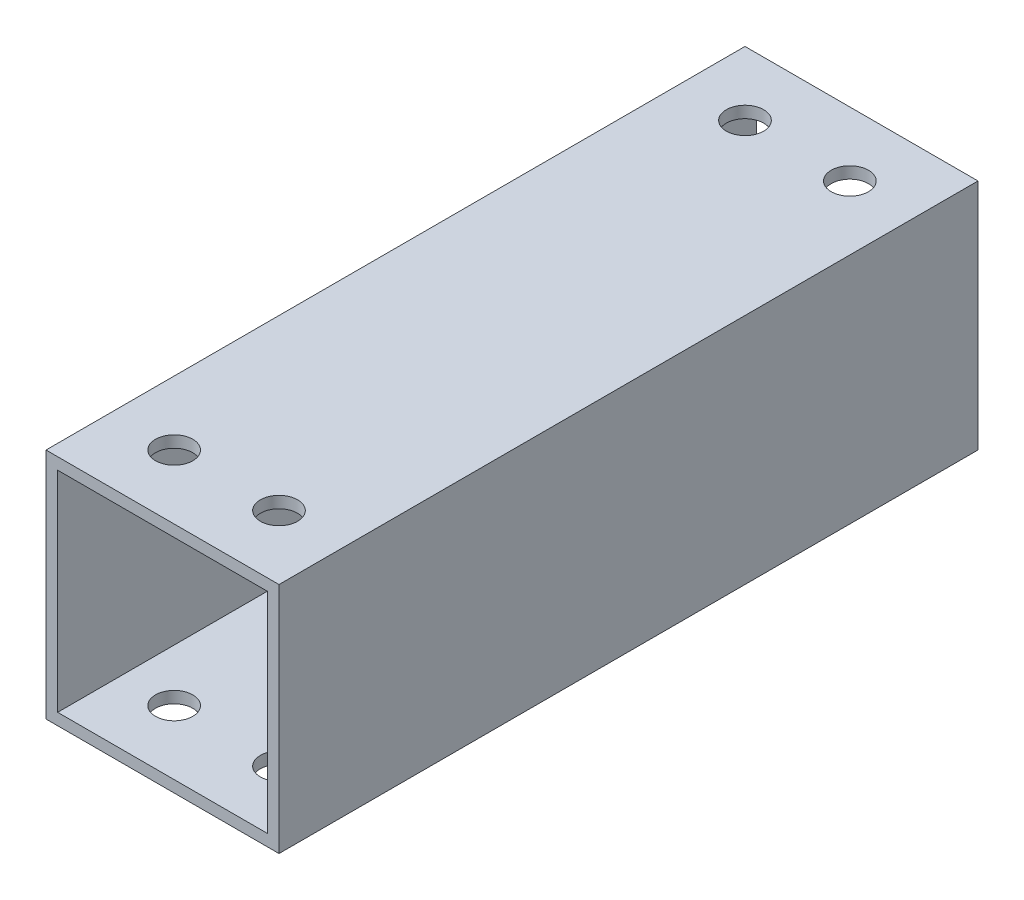
ISO-10303-21;
HEADER;
FILE_DESCRIPTION(('STEP AP214'),'2;1');
FILE_NAME('part.step','',(''),(''),'','','');
FILE_SCHEMA(('AUTOMOTIVE_DESIGN { 1 0 10303 214 1 1 1 1 }'));
ENDSEC;
DATA;
#1=APPLICATION_CONTEXT('core data for automotive mechanical design processes');
#2=APPLICATION_PROTOCOL_DEFINITION('international standard','automotive_design',2000,#1);
#3=PRODUCT_CONTEXT('',#1,'mechanical');
#4=PRODUCT('Part','Part','',(#3));
#5=PRODUCT_RELATED_PRODUCT_CATEGORY('part','',(#4));
#6=PRODUCT_DEFINITION_FORMATION('','',#4);
#7=PRODUCT_DEFINITION_CONTEXT('part definition',#1,'design');
#8=PRODUCT_DEFINITION('design','',#6,#7);
#9=PRODUCT_DEFINITION_SHAPE('','',#8);
#10=(LENGTH_UNIT() NAMED_UNIT(*) SI_UNIT(.MILLI.,.METRE.));
#11=(NAMED_UNIT(*) PLANE_ANGLE_UNIT() SI_UNIT($,.RADIAN.));
#12=(NAMED_UNIT(*) SI_UNIT($,.STERADIAN.) SOLID_ANGLE_UNIT());
#13=UNCERTAINTY_MEASURE_WITH_UNIT(LENGTH_MEASURE(1.E-05),#10,'distance_accuracy_value','');
#14=(GEOMETRIC_REPRESENTATION_CONTEXT(3) GLOBAL_UNCERTAINTY_ASSIGNED_CONTEXT((#13)) GLOBAL_UNIT_ASSIGNED_CONTEXT((#10,
#11,#12)) REPRESENTATION_CONTEXT('',''));
#15=CARTESIAN_POINT('',(0.,0.,0.));
#16=DIRECTION('',(0.,0.,1.));
#17=DIRECTION('',(1.,0.,0.));
#18=AXIS2_PLACEMENT_3D('',#15,#16,#17);
#19=CARTESIAN_POINT('',(0.,0.,60.));
#20=DIRECTION('',(0.,0.,1.));
#21=DIRECTION('',(1.,0.,0.));
#22=AXIS2_PLACEMENT_3D('',#19,#20,#21);
#23=PLANE('',#22);
#24=DIRECTION('',(0.,1.,0.));
#25=VECTOR('',#24,1.);
#26=CARTESIAN_POINT('',(10.,10.,60.));
#27=LINE('',#26,#25);
#28=CARTESIAN_POINT('',(10.,-10.,60.));
#29=VERTEX_POINT('',#28);
#30=CARTESIAN_POINT('',(10.,10.,60.));
#31=VERTEX_POINT('',#30);
#32=EDGE_CURVE('E143',#29,#31,#27,.T.);
#33=ORIENTED_EDGE('',*,*,#32,.T.);
#34=DIRECTION('',(-1.,0.,0.));
#35=VECTOR('',#34,1.);
#36=CARTESIAN_POINT('',(-10.,10.,60.));
#37=LINE('',#36,#35);
#38=CARTESIAN_POINT('',(-10.,10.,60.));
#39=VERTEX_POINT('',#38);
#40=EDGE_CURVE('E146',#31,#39,#37,.T.);
#41=ORIENTED_EDGE('',*,*,#40,.T.);
#42=DIRECTION('',(0.,-1.,0.));
#43=VECTOR('',#42,1.);
#44=CARTESIAN_POINT('',(-10.,10.,60.));
#45=LINE('',#44,#43);
#46=CARTESIAN_POINT('',(-10.,-10.,60.));
#47=VERTEX_POINT('',#46);
#48=EDGE_CURVE('E149',#39,#47,#45,.T.);
#49=ORIENTED_EDGE('',*,*,#48,.T.);
#50=DIRECTION('',(1.,0.,0.));
#51=VECTOR('',#50,1.);
#52=CARTESIAN_POINT('',(-10.,-10.,60.));
#53=LINE('',#52,#51);
#54=EDGE_CURVE('E151',#47,#29,#53,.T.);
#55=ORIENTED_EDGE('',*,*,#54,.T.);
#56=EDGE_LOOP('',(#33,#41,#49,#55));
#57=FACE_BOUND('',#56,.T.);
#58=DIRECTION('',(-1.,0.,0.));
#59=VECTOR('',#58,1.);
#60=CARTESIAN_POINT('',(-9.,9.,60.));
#61=LINE('',#60,#59);
#62=CARTESIAN_POINT('',(9.,9.,60.));
#63=VERTEX_POINT('',#62);
#64=CARTESIAN_POINT('',(-9.,9.,60.));
#65=VERTEX_POINT('',#64);
#66=EDGE_CURVE('E113',#63,#65,#61,.T.);
#67=ORIENTED_EDGE('',*,*,#66,.F.);
#68=DIRECTION('',(0.,1.,0.));
#69=VECTOR('',#68,1.);
#70=CARTESIAN_POINT('',(9.,9.,60.));
#71=LINE('',#70,#69);
#72=CARTESIAN_POINT('',(9.00000000000001,-9.,60.));
#73=VERTEX_POINT('',#72);
#74=EDGE_CURVE('E105',#73,#63,#71,.T.);
#75=ORIENTED_EDGE('',*,*,#74,.F.);
#76=DIRECTION('',(1.,0.,0.));
#77=VECTOR('',#76,1.);
#78=CARTESIAN_POINT('',(-8.99999999999999,-9.,60.));
#79=LINE('',#78,#77);
#80=CARTESIAN_POINT('',(-8.99999999999999,-9.,60.));
#81=VERTEX_POINT('',#80);
#82=EDGE_CURVE('E127',#81,#73,#79,.T.);
#83=ORIENTED_EDGE('',*,*,#82,.F.);
#84=DIRECTION('',(0.,-1.,0.));
#85=VECTOR('',#84,1.);
#86=CARTESIAN_POINT('',(-9.,9.,60.));
#87=LINE('',#86,#85);
#88=EDGE_CURVE('E125',#65,#81,#87,.T.);
#89=ORIENTED_EDGE('',*,*,#88,.F.);
#90=EDGE_LOOP('',(#67,#75,#83,#89));
#91=FACE_BOUND('',#90,.T.);
#92=ADVANCED_FACE('F38',(#57,#91),#23,.T.);
#93=CARTESIAN_POINT('',(0.,0.,0.));
#94=DIRECTION('',(0.,0.,1.));
#95=DIRECTION('',(1.,0.,0.));
#96=AXIS2_PLACEMENT_3D('',#93,#94,#95);
#97=PLANE('',#96);
#98=DIRECTION('',(0.,1.,0.));
#99=VECTOR('',#98,1.);
#100=CARTESIAN_POINT('',(10.,10.,0.));
#101=LINE('',#100,#99);
#102=CARTESIAN_POINT('',(10.,-10.,0.));
#103=VERTEX_POINT('',#102);
#104=CARTESIAN_POINT('',(10.,10.,0.));
#105=VERTEX_POINT('',#104);
#106=EDGE_CURVE('E121',#103,#105,#101,.T.);
#107=ORIENTED_EDGE('',*,*,#106,.F.);
#108=DIRECTION('',(1.,0.,0.));
#109=VECTOR('',#108,1.);
#110=CARTESIAN_POINT('',(-10.,-10.,0.));
#111=LINE('',#110,#109);
#112=CARTESIAN_POINT('',(-10.,-10.,0.));
#113=VERTEX_POINT('',#112);
#114=EDGE_CURVE('E147',#113,#103,#111,.T.);
#115=ORIENTED_EDGE('',*,*,#114,.F.);
#116=DIRECTION('',(0.,-1.,0.));
#117=VECTOR('',#116,1.);
#118=CARTESIAN_POINT('',(-10.,10.,0.));
#119=LINE('',#118,#117);
#120=CARTESIAN_POINT('',(-10.,10.,0.));
#121=VERTEX_POINT('',#120);
#122=EDGE_CURVE('E158',#121,#113,#119,.T.);
#123=ORIENTED_EDGE('',*,*,#122,.F.);
#124=DIRECTION('',(-1.,0.,0.));
#125=VECTOR('',#124,1.);
#126=CARTESIAN_POINT('',(-10.,10.,0.));
#127=LINE('',#126,#125);
#128=EDGE_CURVE('E156',#105,#121,#127,.T.);
#129=ORIENTED_EDGE('',*,*,#128,.F.);
#130=EDGE_LOOP('',(#107,#115,#123,#129));
#131=FACE_BOUND('',#130,.T.);
#132=DIRECTION('',(0.,1.,0.));
#133=VECTOR('',#132,1.);
#134=CARTESIAN_POINT('',(9.,9.,0.));
#135=LINE('',#134,#133);
#136=CARTESIAN_POINT('',(9.00000000000001,-9.,0.));
#137=VERTEX_POINT('',#136);
#138=CARTESIAN_POINT('',(9.,9.,0.));
#139=VERTEX_POINT('',#138);
#140=EDGE_CURVE('E63',#137,#139,#135,.T.);
#141=ORIENTED_EDGE('',*,*,#140,.T.);
#142=DIRECTION('',(-1.,0.,0.));
#143=VECTOR('',#142,1.);
#144=CARTESIAN_POINT('',(-9.,9.,0.));
#145=LINE('',#144,#143);
#146=CARTESIAN_POINT('',(-9.,9.,0.));
#147=VERTEX_POINT('',#146);
#148=EDGE_CURVE('E120',#139,#147,#145,.T.);
#149=ORIENTED_EDGE('',*,*,#148,.T.);
#150=DIRECTION('',(0.,-1.,0.));
#151=VECTOR('',#150,1.);
#152=CARTESIAN_POINT('',(-9.,9.,0.));
#153=LINE('',#152,#151);
#154=CARTESIAN_POINT('',(-8.99999999999999,-9.,0.));
#155=VERTEX_POINT('',#154);
#156=EDGE_CURVE('E135',#147,#155,#153,.T.);
#157=ORIENTED_EDGE('',*,*,#156,.T.);
#158=DIRECTION('',(1.,0.,0.));
#159=VECTOR('',#158,1.);
#160=CARTESIAN_POINT('',(-8.99999999999999,-9.,0.));
#161=LINE('',#160,#159);
#162=EDGE_CURVE('E114',#155,#137,#161,.T.);
#163=ORIENTED_EDGE('',*,*,#162,.T.);
#164=EDGE_LOOP('',(#141,#149,#157,#163));
#165=FACE_BOUND('',#164,.T.);
#166=ADVANCED_FACE('F210',(#131,#165),#97,.F.);
#167=CARTESIAN_POINT('',(10.,10.,60.));
#168=DIRECTION('',(-1.,0.,0.));
#169=DIRECTION('',(0.,-1.,0.));
#170=AXIS2_PLACEMENT_3D('',#167,#168,#169);
#171=PLANE('',#170);
#172=ORIENTED_EDGE('',*,*,#106,.T.);
#173=DIRECTION('',(0.,0.,-1.));
#174=VECTOR('',#173,1.);
#175=CARTESIAN_POINT('',(10.,10.,60.));
#176=LINE('',#175,#174);
#177=EDGE_CURVE('E11',#31,#105,#176,.T.);
#178=ORIENTED_EDGE('',*,*,#177,.F.);
#179=ORIENTED_EDGE('',*,*,#32,.F.);
#180=DIRECTION('',(0.,0.,-1.));
#181=VECTOR('',#180,1.);
#182=CARTESIAN_POINT('',(10.,-10.,60.));
#183=LINE('',#182,#181);
#184=EDGE_CURVE('E153',#29,#103,#183,.T.);
#185=ORIENTED_EDGE('',*,*,#184,.T.);
#186=EDGE_LOOP('',(#172,#178,#179,#185));
#187=FACE_BOUND('',#186,.T.);
#188=ADVANCED_FACE('F40',(#187),#171,.F.);
#189=CARTESIAN_POINT('',(-10.,10.,60.));
#190=DIRECTION('',(0.,-1.,0.));
#191=DIRECTION('',(0.,0.,-1.));
#192=AXIS2_PLACEMENT_3D('',#189,#190,#191);
#193=PLANE('',#192);
#194=CARTESIAN_POINT('',(-4.5,10.,54.5));
#195=DIRECTION('',(0.,1.,0.));
#196=DIRECTION('',(0.,0.,-1.));
#197=AXIS2_PLACEMENT_3D('',#194,#195,#196);
#198=CIRCLE('',#197,1.6);
#199=CARTESIAN_POINT('',(-4.5,10.,52.9));
#200=VERTEX_POINT('',#199);
#201=EDGE_CURVE('E246',#200,#200,#198,.T.);
#202=ORIENTED_EDGE('',*,*,#201,.F.);
#203=EDGE_LOOP('',(#202));
#204=FACE_BOUND('',#203,.T.);
#205=CARTESIAN_POINT('',(4.5,10.,54.5));
#206=DIRECTION('',(0.,1.,0.));
#207=DIRECTION('',(0.,0.,1.));
#208=AXIS2_PLACEMENT_3D('',#205,#206,#207);
#209=CIRCLE('',#208,1.6);
#210=CARTESIAN_POINT('',(4.5,10.,56.1));
#211=VERTEX_POINT('',#210);
#212=EDGE_CURVE('E250',#211,#211,#209,.T.);
#213=ORIENTED_EDGE('',*,*,#212,.F.);
#214=EDGE_LOOP('',(#213));
#215=FACE_BOUND('',#214,.T.);
#216=CARTESIAN_POINT('',(4.49999999999999,10.,5.49999999999999));
#217=DIRECTION('',(0.,1.,0.));
#218=DIRECTION('',(0.,0.,-1.));
#219=AXIS2_PLACEMENT_3D('',#216,#217,#218);
#220=CIRCLE('',#219,1.6);
#221=CARTESIAN_POINT('',(4.49999999999999,10.,3.9));
#222=VERTEX_POINT('',#221);
#223=EDGE_CURVE('E254',#222,#222,#220,.T.);
#224=ORIENTED_EDGE('',*,*,#223,.F.);
#225=EDGE_LOOP('',(#224));
#226=FACE_BOUND('',#225,.T.);
#227=CARTESIAN_POINT('',(-4.49999999999999,10.,5.49999999999999));
#228=DIRECTION('',(0.,1.,0.));
#229=DIRECTION('',(0.,0.,1.));
#230=AXIS2_PLACEMENT_3D('',#227,#228,#229);
#231=CIRCLE('',#230,1.6);
#232=CARTESIAN_POINT('',(-4.49999999999999,10.,7.09999999999999));
#233=VERTEX_POINT('',#232);
#234=EDGE_CURVE('E258',#233,#233,#231,.T.);
#235=ORIENTED_EDGE('',*,*,#234,.F.);
#236=EDGE_LOOP('',(#235));
#237=FACE_BOUND('',#236,.T.);
#238=ORIENTED_EDGE('',*,*,#128,.T.);
#239=DIRECTION('',(0.,0.,-1.));
#240=VECTOR('',#239,1.);
#241=CARTESIAN_POINT('',(-10.,10.,60.));
#242=LINE('',#241,#240);
#243=EDGE_CURVE('E47',#39,#121,#242,.T.);
#244=ORIENTED_EDGE('',*,*,#243,.F.);
#245=ORIENTED_EDGE('',*,*,#40,.F.);
#246=ORIENTED_EDGE('',*,*,#177,.T.);
#247=EDGE_LOOP('',(#238,#244,#245,#246));
#248=FACE_BOUND('',#247,.T.);
#249=ADVANCED_FACE('F235',(#204,#215,#226,#237,#248),#193,.F.);
#250=CARTESIAN_POINT('',(-10.,10.,60.));
#251=DIRECTION('',(1.,0.,0.));
#252=DIRECTION('',(0.,1.,0.));
#253=AXIS2_PLACEMENT_3D('',#250,#251,#252);
#254=PLANE('',#253);
#255=ORIENTED_EDGE('',*,*,#122,.T.);
#256=DIRECTION('',(0.,0.,-1.));
#257=VECTOR('',#256,1.);
#258=CARTESIAN_POINT('',(-10.,-10.,60.));
#259=LINE('',#258,#257);
#260=EDGE_CURVE('E163',#47,#113,#259,.T.);
#261=ORIENTED_EDGE('',*,*,#260,.F.);
#262=ORIENTED_EDGE('',*,*,#48,.F.);
#263=ORIENTED_EDGE('',*,*,#243,.T.);
#264=EDGE_LOOP('',(#255,#261,#262,#263));
#265=FACE_BOUND('',#264,.T.);
#266=ADVANCED_FACE('F232',(#265),#254,.F.);
#267=CARTESIAN_POINT('',(-10.,-10.,60.));
#268=DIRECTION('',(0.,1.,0.));
#269=DIRECTION('',(0.,0.,1.));
#270=AXIS2_PLACEMENT_3D('',#267,#268,#269);
#271=PLANE('',#270);
#272=CARTESIAN_POINT('',(-4.5,-10.,54.5));
#273=DIRECTION('',(0.,1.,0.));
#274=DIRECTION('',(0.,0.,-1.));
#275=AXIS2_PLACEMENT_3D('',#272,#273,#274);
#276=CIRCLE('',#275,1.6);
#277=CARTESIAN_POINT('',(-4.5,-10.,52.9));
#278=VERTEX_POINT('',#277);
#279=EDGE_CURVE('E278',#278,#278,#276,.T.);
#280=ORIENTED_EDGE('',*,*,#279,.T.);
#281=EDGE_LOOP('',(#280));
#282=FACE_BOUND('',#281,.T.);
#283=CARTESIAN_POINT('',(4.5,-10.,54.5));
#284=DIRECTION('',(0.,1.,0.));
#285=DIRECTION('',(0.,0.,1.));
#286=AXIS2_PLACEMENT_3D('',#283,#284,#285);
#287=CIRCLE('',#286,1.6);
#288=CARTESIAN_POINT('',(4.5,-10.,56.1));
#289=VERTEX_POINT('',#288);
#290=EDGE_CURVE('E282',#289,#289,#287,.T.);
#291=ORIENTED_EDGE('',*,*,#290,.T.);
#292=EDGE_LOOP('',(#291));
#293=FACE_BOUND('',#292,.T.);
#294=CARTESIAN_POINT('',(4.49999999999999,-10.,5.49999999999999));
#295=DIRECTION('',(0.,1.,0.));
#296=DIRECTION('',(0.,0.,-1.));
#297=AXIS2_PLACEMENT_3D('',#294,#295,#296);
#298=CIRCLE('',#297,1.6);
#299=CARTESIAN_POINT('',(4.49999999999999,-10.,3.9));
#300=VERTEX_POINT('',#299);
#301=EDGE_CURVE('E271',#300,#300,#298,.T.);
#302=ORIENTED_EDGE('',*,*,#301,.T.);
#303=EDGE_LOOP('',(#302));
#304=FACE_BOUND('',#303,.T.);
#305=CARTESIAN_POINT('',(-4.49999999999999,-10.,5.49999999999999));
#306=DIRECTION('',(0.,1.,0.));
#307=DIRECTION('',(0.,0.,1.));
#308=AXIS2_PLACEMENT_3D('',#305,#306,#307);
#309=CIRCLE('',#308,1.6);
#310=CARTESIAN_POINT('',(-4.49999999999999,-10.,7.09999999999999));
#311=VERTEX_POINT('',#310);
#312=EDGE_CURVE('E172',#311,#311,#309,.T.);
#313=ORIENTED_EDGE('',*,*,#312,.T.);
#314=EDGE_LOOP('',(#313));
#315=FACE_BOUND('',#314,.T.);
#316=ORIENTED_EDGE('',*,*,#114,.T.);
#317=ORIENTED_EDGE('',*,*,#184,.F.);
#318=ORIENTED_EDGE('',*,*,#54,.F.);
#319=ORIENTED_EDGE('',*,*,#260,.T.);
#320=EDGE_LOOP('',(#316,#317,#318,#319));
#321=FACE_BOUND('',#320,.T.);
#322=ADVANCED_FACE('F229',(#282,#293,#304,#315,#321),#271,.F.);
#323=CARTESIAN_POINT('',(9.,9.,60.));
#324=DIRECTION('',(-1.,0.,0.));
#325=DIRECTION('',(0.,-1.,0.));
#326=AXIS2_PLACEMENT_3D('',#323,#324,#325);
#327=PLANE('',#326);
#328=ORIENTED_EDGE('',*,*,#140,.F.);
#329=DIRECTION('',(0.,0.,-1.));
#330=VECTOR('',#329,1.);
#331=CARTESIAN_POINT('',(9.00000000000001,-9.,60.));
#332=LINE('',#331,#330);
#333=EDGE_CURVE('E109',#73,#137,#332,.T.);
#334=ORIENTED_EDGE('',*,*,#333,.F.);
#335=ORIENTED_EDGE('',*,*,#74,.T.);
#336=DIRECTION('',(0.,0.,-1.));
#337=VECTOR('',#336,1.);
#338=CARTESIAN_POINT('',(9.,9.,60.));
#339=LINE('',#338,#337);
#340=EDGE_CURVE('E108',#63,#139,#339,.T.);
#341=ORIENTED_EDGE('',*,*,#340,.T.);
#342=EDGE_LOOP('',(#328,#334,#335,#341));
#343=FACE_BOUND('',#342,.T.);
#344=ADVANCED_FACE('F107',(#343),#327,.T.);
#345=CARTESIAN_POINT('',(-9.,9.,60.));
#346=DIRECTION('',(0.,-1.,0.));
#347=DIRECTION('',(0.,0.,-1.));
#348=AXIS2_PLACEMENT_3D('',#345,#346,#347);
#349=PLANE('',#348);
#350=CARTESIAN_POINT('',(-4.5,9.,54.5));
#351=DIRECTION('',(0.,-1.,0.));
#352=DIRECTION('',(0.,0.,-1.));
#353=AXIS2_PLACEMENT_3D('',#350,#351,#352);
#354=CIRCLE('',#353,1.6);
#355=CARTESIAN_POINT('',(-4.5,9.,52.9));
#356=VERTEX_POINT('',#355);
#357=EDGE_CURVE('E133',#356,#356,#354,.T.);
#358=ORIENTED_EDGE('',*,*,#357,.F.);
#359=EDGE_LOOP('',(#358));
#360=FACE_BOUND('',#359,.T.);
#361=CARTESIAN_POINT('',(4.5,9.,54.5));
#362=DIRECTION('',(0.,-1.,0.));
#363=DIRECTION('',(0.,0.,-1.));
#364=AXIS2_PLACEMENT_3D('',#361,#362,#363);
#365=CIRCLE('',#364,1.6);
#366=CARTESIAN_POINT('',(4.5,9.,52.9));
#367=VERTEX_POINT('',#366);
#368=EDGE_CURVE('E178',#367,#367,#365,.T.);
#369=ORIENTED_EDGE('',*,*,#368,.F.);
#370=EDGE_LOOP('',(#369));
#371=FACE_BOUND('',#370,.T.);
#372=CARTESIAN_POINT('',(4.49999999999999,9.,5.49999999999999));
#373=DIRECTION('',(0.,-1.,0.));
#374=DIRECTION('',(0.,0.,-1.));
#375=AXIS2_PLACEMENT_3D('',#372,#373,#374);
#376=CIRCLE('',#375,1.6);
#377=CARTESIAN_POINT('',(4.49999999999999,9.,3.9));
#378=VERTEX_POINT('',#377);
#379=EDGE_CURVE('E175',#378,#378,#376,.T.);
#380=ORIENTED_EDGE('',*,*,#379,.F.);
#381=EDGE_LOOP('',(#380));
#382=FACE_BOUND('',#381,.T.);
#383=CARTESIAN_POINT('',(-4.49999999999999,9.,5.49999999999999));
#384=DIRECTION('',(0.,-1.,0.));
#385=DIRECTION('',(0.,0.,-1.));
#386=AXIS2_PLACEMENT_3D('',#383,#384,#385);
#387=CIRCLE('',#386,1.6);
#388=CARTESIAN_POINT('',(-4.49999999999999,9.,3.89999999999999));
#389=VERTEX_POINT('',#388);
#390=EDGE_CURVE('E171',#389,#389,#387,.T.);
#391=ORIENTED_EDGE('',*,*,#390,.F.);
#392=EDGE_LOOP('',(#391));
#393=FACE_BOUND('',#392,.T.);
#394=ORIENTED_EDGE('',*,*,#148,.F.);
#395=ORIENTED_EDGE('',*,*,#340,.F.);
#396=ORIENTED_EDGE('',*,*,#66,.T.);
#397=DIRECTION('',(0.,0.,-1.));
#398=VECTOR('',#397,1.);
#399=CARTESIAN_POINT('',(-9.,9.,60.));
#400=LINE('',#399,#398);
#401=EDGE_CURVE('E122',#65,#147,#400,.T.);
#402=ORIENTED_EDGE('',*,*,#401,.T.);
#403=EDGE_LOOP('',(#394,#395,#396,#402));
#404=FACE_BOUND('',#403,.T.);
#405=ADVANCED_FACE('F117',(#360,#371,#382,#393,#404),#349,.T.);
#406=CARTESIAN_POINT('',(-9.,9.,60.));
#407=DIRECTION('',(1.,0.,0.));
#408=DIRECTION('',(0.,1.,0.));
#409=AXIS2_PLACEMENT_3D('',#406,#407,#408);
#410=PLANE('',#409);
#411=ORIENTED_EDGE('',*,*,#156,.F.);
#412=ORIENTED_EDGE('',*,*,#401,.F.);
#413=ORIENTED_EDGE('',*,*,#88,.T.);
#414=DIRECTION('',(0.,0.,-1.));
#415=VECTOR('',#414,1.);
#416=CARTESIAN_POINT('',(-8.99999999999999,-9.,60.));
#417=LINE('',#416,#415);
#418=EDGE_CURVE('E55',#81,#155,#417,.T.);
#419=ORIENTED_EDGE('',*,*,#418,.T.);
#420=EDGE_LOOP('',(#411,#412,#413,#419));
#421=FACE_BOUND('',#420,.T.);
#422=ADVANCED_FACE('F202',(#421),#410,.T.);
#423=CARTESIAN_POINT('',(-8.99999999999999,-9.,60.));
#424=DIRECTION('',(0.,1.,0.));
#425=DIRECTION('',(0.,0.,1.));
#426=AXIS2_PLACEMENT_3D('',#423,#424,#425);
#427=PLANE('',#426);
#428=CARTESIAN_POINT('',(-4.5,-9.,54.5));
#429=DIRECTION('',(0.,1.,0.));
#430=DIRECTION('',(0.,0.,1.));
#431=AXIS2_PLACEMENT_3D('',#428,#429,#430);
#432=CIRCLE('',#431,1.6);
#433=CARTESIAN_POINT('',(-4.5,-9.,56.1));
#434=VERTEX_POINT('',#433);
#435=EDGE_CURVE('E42',#434,#434,#432,.T.);
#436=ORIENTED_EDGE('',*,*,#435,.F.);
#437=EDGE_LOOP('',(#436));
#438=FACE_BOUND('',#437,.T.);
#439=CARTESIAN_POINT('',(4.5,-9.,54.5));
#440=DIRECTION('',(0.,1.,0.));
#441=DIRECTION('',(0.,0.,1.));
#442=AXIS2_PLACEMENT_3D('',#439,#440,#441);
#443=CIRCLE('',#442,1.6);
#444=CARTESIAN_POINT('',(4.5,-9.,56.1));
#445=VERTEX_POINT('',#444);
#446=EDGE_CURVE('E176',#445,#445,#443,.T.);
#447=ORIENTED_EDGE('',*,*,#446,.F.);
#448=EDGE_LOOP('',(#447));
#449=FACE_BOUND('',#448,.T.);
#450=CARTESIAN_POINT('',(4.49999999999999,-9.,5.49999999999999));
#451=DIRECTION('',(0.,1.,0.));
#452=DIRECTION('',(0.,0.,1.));
#453=AXIS2_PLACEMENT_3D('',#450,#451,#452);
#454=CIRCLE('',#453,1.6);
#455=CARTESIAN_POINT('',(4.49999999999999,-9.,7.09999999999999));
#456=VERTEX_POINT('',#455);
#457=EDGE_CURVE('E173',#456,#456,#454,.T.);
#458=ORIENTED_EDGE('',*,*,#457,.F.);
#459=EDGE_LOOP('',(#458));
#460=FACE_BOUND('',#459,.T.);
#461=CARTESIAN_POINT('',(-4.49999999999999,-9.,5.49999999999999));
#462=DIRECTION('',(0.,1.,0.));
#463=DIRECTION('',(0.,0.,1.));
#464=AXIS2_PLACEMENT_3D('',#461,#462,#463);
#465=CIRCLE('',#464,1.6);
#466=CARTESIAN_POINT('',(-4.49999999999999,-9.,7.09999999999999));
#467=VERTEX_POINT('',#466);
#468=EDGE_CURVE('E168',#467,#467,#465,.T.);
#469=ORIENTED_EDGE('',*,*,#468,.F.);
#470=EDGE_LOOP('',(#469));
#471=FACE_BOUND('',#470,.T.);
#472=ORIENTED_EDGE('',*,*,#162,.F.);
#473=ORIENTED_EDGE('',*,*,#418,.F.);
#474=ORIENTED_EDGE('',*,*,#82,.T.);
#475=ORIENTED_EDGE('',*,*,#333,.T.);
#476=EDGE_LOOP('',(#472,#473,#474,#475));
#477=FACE_BOUND('',#476,.T.);
#478=ADVANCED_FACE('F198',(#438,#449,#460,#471,#477),#427,.T.);
#479=CARTESIAN_POINT('',(-4.49999999999999,-10.,5.49999999999999));
#480=DIRECTION('',(0.,1.,0.));
#481=DIRECTION('',(0.,0.,1.));
#482=AXIS2_PLACEMENT_3D('',#479,#480,#481);
#483=CYLINDRICAL_SURFACE('',#482,1.6);
#484=ORIENTED_EDGE('',*,*,#468,.T.);
#485=EDGE_LOOP('',(#484));
#486=FACE_BOUND('',#485,.T.);
#487=ORIENTED_EDGE('',*,*,#312,.F.);
#488=EDGE_LOOP('',(#487));
#489=FACE_BOUND('',#488,.T.);
#490=ADVANCED_FACE('F201',(#486,#489),#483,.F.);
#491=CARTESIAN_POINT('',(4.49999999999999,-10.,5.49999999999999));
#492=DIRECTION('',(0.,1.,0.));
#493=DIRECTION('',(0.,0.,1.));
#494=AXIS2_PLACEMENT_3D('',#491,#492,#493);
#495=CYLINDRICAL_SURFACE('',#494,1.6);
#496=ORIENTED_EDGE('',*,*,#457,.T.);
#497=EDGE_LOOP('',(#496));
#498=FACE_BOUND('',#497,.T.);
#499=ORIENTED_EDGE('',*,*,#301,.F.);
#500=EDGE_LOOP('',(#499));
#501=FACE_BOUND('',#500,.T.);
#502=ADVANCED_FACE('F291',(#498,#501),#495,.F.);
#503=CARTESIAN_POINT('',(4.5,-10.,54.5));
#504=DIRECTION('',(0.,1.,0.));
#505=DIRECTION('',(0.,0.,1.));
#506=AXIS2_PLACEMENT_3D('',#503,#504,#505);
#507=CYLINDRICAL_SURFACE('',#506,1.6);
#508=ORIENTED_EDGE('',*,*,#446,.T.);
#509=EDGE_LOOP('',(#508));
#510=FACE_BOUND('',#509,.T.);
#511=ORIENTED_EDGE('',*,*,#290,.F.);
#512=EDGE_LOOP('',(#511));
#513=FACE_BOUND('',#512,.T.);
#514=ADVANCED_FACE('F299',(#510,#513),#507,.F.);
#515=CARTESIAN_POINT('',(-4.5,-10.,54.5));
#516=DIRECTION('',(0.,1.,0.));
#517=DIRECTION('',(0.,0.,1.));
#518=AXIS2_PLACEMENT_3D('',#515,#516,#517);
#519=CYLINDRICAL_SURFACE('',#518,1.6);
#520=ORIENTED_EDGE('',*,*,#435,.T.);
#521=EDGE_LOOP('',(#520));
#522=FACE_BOUND('',#521,.T.);
#523=ORIENTED_EDGE('',*,*,#279,.F.);
#524=EDGE_LOOP('',(#523));
#525=FACE_BOUND('',#524,.T.);
#526=ADVANCED_FACE('F195',(#522,#525),#519,.F.);
#527=ORIENTED_EDGE('',*,*,#390,.T.);
#528=EDGE_LOOP('',(#527));
#529=FACE_BOUND('',#528,.T.);
#530=ORIENTED_EDGE('',*,*,#234,.T.);
#531=EDGE_LOOP('',(#530));
#532=FACE_BOUND('',#531,.T.);
#533=ADVANCED_FACE('F289',(#529,#532),#483,.F.);
#534=ORIENTED_EDGE('',*,*,#379,.T.);
#535=EDGE_LOOP('',(#534));
#536=FACE_BOUND('',#535,.T.);
#537=ORIENTED_EDGE('',*,*,#223,.T.);
#538=EDGE_LOOP('',(#537));
#539=FACE_BOUND('',#538,.T.);
#540=ADVANCED_FACE('F286',(#536,#539),#495,.F.);
#541=ORIENTED_EDGE('',*,*,#368,.T.);
#542=EDGE_LOOP('',(#541));
#543=FACE_BOUND('',#542,.T.);
#544=ORIENTED_EDGE('',*,*,#212,.T.);
#545=EDGE_LOOP('',(#544));
#546=FACE_BOUND('',#545,.T.);
#547=ADVANCED_FACE('F288',(#543,#546),#507,.F.);
#548=ORIENTED_EDGE('',*,*,#357,.T.);
#549=EDGE_LOOP('',(#548));
#550=FACE_BOUND('',#549,.T.);
#551=ORIENTED_EDGE('',*,*,#201,.T.);
#552=EDGE_LOOP('',(#551));
#553=FACE_BOUND('',#552,.T.);
#554=ADVANCED_FACE('F296',(#550,#553),#519,.F.);
#555=CLOSED_SHELL('',(#92,#166,#188,#249,#266,#322,#344,#405,#422,#478,#490,#502,#514,#526,#533,
#540,#547,#554));
#556=MANIFOLD_SOLID_BREP('B2',#555);
#557=ADVANCED_BREP_SHAPE_REPRESENTATION('',(#18,#556),#14);
#558=SHAPE_DEFINITION_REPRESENTATION(#9,#557);
ENDSEC;
END-ISO-10303-21;
